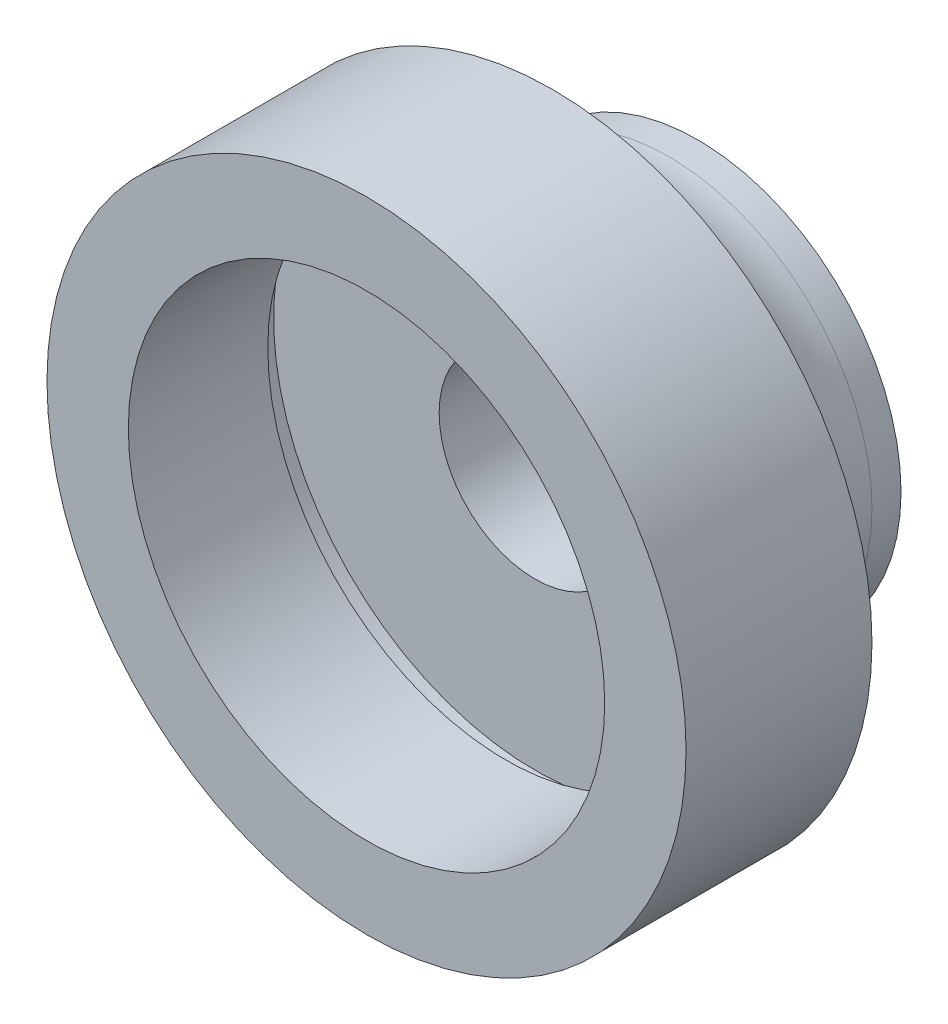
ISO-10303-21;
HEADER;
FILE_DESCRIPTION(('STEP AP214'),'2;1');
FILE_NAME('part.step','',(''),(''),'','','');
FILE_SCHEMA(('AUTOMOTIVE_DESIGN { 1 0 10303 214 1 1 1 1 }'));
ENDSEC;
DATA;
#1=APPLICATION_CONTEXT('core data for automotive mechanical design processes');
#2=APPLICATION_PROTOCOL_DEFINITION('international standard','automotive_design',2000,#1);
#3=PRODUCT_CONTEXT('',#1,'mechanical');
#4=PRODUCT('Part','Part','',(#3));
#5=PRODUCT_RELATED_PRODUCT_CATEGORY('part','',(#4));
#6=PRODUCT_DEFINITION_FORMATION('','',#4);
#7=PRODUCT_DEFINITION_CONTEXT('part definition',#1,'design');
#8=PRODUCT_DEFINITION('design','',#6,#7);
#9=PRODUCT_DEFINITION_SHAPE('','',#8);
#10=(LENGTH_UNIT() NAMED_UNIT(*) SI_UNIT(.MILLI.,.METRE.));
#11=(NAMED_UNIT(*) PLANE_ANGLE_UNIT() SI_UNIT($,.RADIAN.));
#12=(NAMED_UNIT(*) SI_UNIT($,.STERADIAN.) SOLID_ANGLE_UNIT());
#13=UNCERTAINTY_MEASURE_WITH_UNIT(LENGTH_MEASURE(1.E-05),#10,'distance_accuracy_value','');
#14=(GEOMETRIC_REPRESENTATION_CONTEXT(3) GLOBAL_UNCERTAINTY_ASSIGNED_CONTEXT((#13)) GLOBAL_UNIT_ASSIGNED_CONTEXT((#10,
#11,#12)) REPRESENTATION_CONTEXT('',''));
#15=CARTESIAN_POINT('',(0.,0.,0.));
#16=DIRECTION('',(0.,0.,1.));
#17=DIRECTION('',(1.,0.,0.));
#18=AXIS2_PLACEMENT_3D('',#15,#16,#17);
#19=CARTESIAN_POINT('',(0.,0.,-1.5));
#20=DIRECTION('',(0.,0.,1.));
#21=DIRECTION('',(1.,0.,0.));
#22=AXIS2_PLACEMENT_3D('',#19,#20,#21);
#23=CYLINDRICAL_SURFACE('',#22,3.5);
#24=CARTESIAN_POINT('',(0.,0.,-1.));
#25=DIRECTION('',(0.,0.,1.));
#26=DIRECTION('',(1.,0.,0.));
#27=AXIS2_PLACEMENT_3D('',#24,#25,#26);
#28=CIRCLE('',#27,3.5);
#29=CARTESIAN_POINT('',(3.5,0.,-1.));
#30=VERTEX_POINT('',#29);
#31=EDGE_CURVE('E10',#30,#30,#28,.F.);
#32=ORIENTED_EDGE('',*,*,#31,.T.);
#33=EDGE_LOOP('',(#32));
#34=FACE_BOUND('',#33,.T.);
#35=CARTESIAN_POINT('',(0.,0.,-1.5));
#36=DIRECTION('',(0.,0.,1.));
#37=DIRECTION('',(1.,0.,0.));
#38=AXIS2_PLACEMENT_3D('',#35,#36,#37);
#39=CIRCLE('',#38,3.5);
#40=CARTESIAN_POINT('',(3.5,0.,-1.5));
#41=VERTEX_POINT('',#40);
#42=EDGE_CURVE('E40',#41,#41,#39,.T.);
#43=ORIENTED_EDGE('',*,*,#42,.T.);
#44=EDGE_LOOP('',(#43));
#45=FACE_BOUND('',#44,.T.);
#46=ADVANCED_FACE('F32',(#34,#45),#23,.T.);
#47=CARTESIAN_POINT('',(0.,0.,-1.5));
#48=DIRECTION('',(0.,0.,1.));
#49=DIRECTION('',(1.,0.,0.));
#50=AXIS2_PLACEMENT_3D('',#47,#48,#49);
#51=PLANE('',#50);
#52=CARTESIAN_POINT('',(0.,0.,-1.5));
#53=DIRECTION('',(0.,0.,-1.));
#54=DIRECTION('',(-1.,0.,0.));
#55=AXIS2_PLACEMENT_3D('',#52,#53,#54);
#56=CIRCLE('',#55,1.65);
#57=CARTESIAN_POINT('',(-1.65,0.,-1.5));
#58=VERTEX_POINT('',#57);
#59=EDGE_CURVE('E50',#58,#58,#56,.T.);
#60=ORIENTED_EDGE('',*,*,#59,.F.);
#61=EDGE_LOOP('',(#60));
#62=FACE_BOUND('',#61,.T.);
#63=ORIENTED_EDGE('',*,*,#42,.F.);
#64=EDGE_LOOP('',(#63));
#65=FACE_BOUND('',#64,.T.);
#66=ADVANCED_FACE('F87',(#62,#65),#51,.F.);
#67=CARTESIAN_POINT('',(0.,0.,4.2));
#68=DIRECTION('',(0.,0.,-1.));
#69=DIRECTION('',(-1.,0.,0.));
#70=AXIS2_PLACEMENT_3D('',#67,#68,#69);
#71=CYLINDRICAL_SURFACE('',#70,5.5);
#72=CARTESIAN_POINT('',(0.,0.,4.2));
#73=DIRECTION('',(0.,0.,1.));
#74=DIRECTION('',(1.,0.,0.));
#75=AXIS2_PLACEMENT_3D('',#72,#73,#74);
#76=CIRCLE('',#75,5.5);
#77=CARTESIAN_POINT('',(5.5,0.,4.2));
#78=VERTEX_POINT('',#77);
#79=EDGE_CURVE('E44',#78,#78,#76,.T.);
#80=ORIENTED_EDGE('',*,*,#79,.F.);
#81=EDGE_LOOP('',(#80));
#82=FACE_BOUND('',#81,.T.);
#83=CARTESIAN_POINT('',(0.,0.,1.));
#84=DIRECTION('',(0.,0.,1.));
#85=DIRECTION('',(1.,0.,0.));
#86=AXIS2_PLACEMENT_3D('',#83,#84,#85);
#87=CIRCLE('',#86,5.5);
#88=CARTESIAN_POINT('',(5.5,0.,1.));
#89=VERTEX_POINT('',#88);
#90=EDGE_CURVE('E52',#89,#89,#87,.T.);
#91=ORIENTED_EDGE('',*,*,#90,.T.);
#92=EDGE_LOOP('',(#91));
#93=FACE_BOUND('',#92,.T.);
#94=ADVANCED_FACE('F91',(#82,#93),#71,.T.);
#95=CARTESIAN_POINT('',(0.,0.,4.2));
#96=DIRECTION('',(0.,0.,1.));
#97=DIRECTION('',(1.,0.,0.));
#98=AXIS2_PLACEMENT_3D('',#95,#96,#97);
#99=PLANE('',#98);
#100=CARTESIAN_POINT('',(0.,0.,4.2));
#101=DIRECTION('',(0.,0.,1.));
#102=DIRECTION('',(1.,0.,0.));
#103=AXIS2_PLACEMENT_3D('',#100,#101,#102);
#104=CIRCLE('',#103,4.1);
#105=CARTESIAN_POINT('',(4.1,0.,4.2));
#106=VERTEX_POINT('',#105);
#107=EDGE_CURVE('E49',#106,#106,#104,.T.);
#108=ORIENTED_EDGE('',*,*,#107,.F.);
#109=EDGE_LOOP('',(#108));
#110=FACE_BOUND('',#109,.T.);
#111=ORIENTED_EDGE('',*,*,#79,.T.);
#112=EDGE_LOOP('',(#111));
#113=FACE_BOUND('',#112,.T.);
#114=ADVANCED_FACE('F98',(#110,#113),#99,.T.);
#115=CARTESIAN_POINT('',(0.,0.,1.3));
#116=DIRECTION('',(0.,0.,1.));
#117=DIRECTION('',(1.,0.,0.));
#118=AXIS2_PLACEMENT_3D('',#115,#116,#117);
#119=CYLINDRICAL_SURFACE('',#118,4.1);
#120=CARTESIAN_POINT('',(0.,0.,1.8));
#121=DIRECTION('',(0.,0.,1.));
#122=DIRECTION('',(1.,0.,0.));
#123=AXIS2_PLACEMENT_3D('',#120,#121,#122);
#124=CIRCLE('',#123,4.1);
#125=CARTESIAN_POINT('',(4.1,0.,1.8));
#126=VERTEX_POINT('',#125);
#127=EDGE_CURVE('E36',#126,#126,#124,.F.);
#128=ORIENTED_EDGE('',*,*,#127,.T.);
#129=EDGE_LOOP('',(#128));
#130=FACE_BOUND('',#129,.T.);
#131=ORIENTED_EDGE('',*,*,#107,.T.);
#132=EDGE_LOOP('',(#131));
#133=FACE_BOUND('',#132,.T.);
#134=ADVANCED_FACE('F71',(#130,#133),#119,.F.);
#135=CARTESIAN_POINT('',(0.,0.,1.3));
#136=DIRECTION('',(0.,0.,1.));
#137=DIRECTION('',(1.,0.,0.));
#138=AXIS2_PLACEMENT_3D('',#135,#136,#137);
#139=PLANE('',#138);
#140=CARTESIAN_POINT('',(0.,0.,1.3));
#141=DIRECTION('',(0.,0.,1.));
#142=DIRECTION('',(1.,0.,0.));
#143=AXIS2_PLACEMENT_3D('',#140,#141,#142);
#144=CIRCLE('',#143,1.65);
#145=CARTESIAN_POINT('',(1.65,0.,1.3));
#146=VERTEX_POINT('',#145);
#147=EDGE_CURVE('E47',#146,#146,#144,.T.);
#148=ORIENTED_EDGE('',*,*,#147,.F.);
#149=EDGE_LOOP('',(#148));
#150=FACE_BOUND('',#149,.T.);
#151=CARTESIAN_POINT('',(0.,0.,1.3));
#152=DIRECTION('',(0.,0.,1.));
#153=DIRECTION('',(1.,0.,0.));
#154=AXIS2_PLACEMENT_3D('',#151,#152,#153);
#155=CIRCLE('',#154,4.5);
#156=CARTESIAN_POINT('',(4.5,0.,1.3));
#157=VERTEX_POINT('',#156);
#158=EDGE_CURVE('E61',#157,#157,#155,.T.);
#159=ORIENTED_EDGE('',*,*,#158,.T.);
#160=EDGE_LOOP('',(#159));
#161=FACE_BOUND('',#160,.T.);
#162=ADVANCED_FACE('F105',(#150,#161),#139,.T.);
#163=CARTESIAN_POINT('',(0.,0.,8.5));
#164=DIRECTION('',(0.,0.,-1.));
#165=DIRECTION('',(-1.,0.,0.));
#166=AXIS2_PLACEMENT_3D('',#163,#164,#165);
#167=CYLINDRICAL_SURFACE('',#166,1.65);
#168=ORIENTED_EDGE('',*,*,#147,.T.);
#169=EDGE_LOOP('',(#168));
#170=FACE_BOUND('',#169,.T.);
#171=ORIENTED_EDGE('',*,*,#59,.T.);
#172=EDGE_LOOP('',(#171));
#173=FACE_BOUND('',#172,.T.);
#174=ADVANCED_FACE('F84',(#170,#173),#167,.F.);
#175=CARTESIAN_POINT('',(0.,0.,-1.));
#176=DIRECTION('',(0.,0.,1.));
#177=DIRECTION('',(1.,0.,0.));
#178=AXIS2_PLACEMENT_3D('',#175,#176,#177);
#179=TOROIDAL_SURFACE('',#178,5.5,2.);
#180=ORIENTED_EDGE('',*,*,#31,.F.);
#181=EDGE_LOOP('',(#180));
#182=FACE_BOUND('',#181,.T.);
#183=ORIENTED_EDGE('',*,*,#90,.F.);
#184=EDGE_LOOP('',(#183));
#185=FACE_BOUND('',#184,.T.);
#186=ADVANCED_FACE('F34',(#182,#185),#179,.F.);
#187=CARTESIAN_POINT('',(0.,0.,1.8));
#188=DIRECTION('',(0.,0.,1.));
#189=DIRECTION('',(1.,0.,0.));
#190=AXIS2_PLACEMENT_3D('',#187,#188,#189);
#191=PLANE('',#190);
#192=CARTESIAN_POINT('',(0.,0.,1.8));
#193=DIRECTION('',(0.,0.,1.));
#194=DIRECTION('',(1.,0.,0.));
#195=AXIS2_PLACEMENT_3D('',#192,#193,#194);
#196=CIRCLE('',#195,4.5);
#197=CARTESIAN_POINT('',(4.5,0.,1.8));
#198=VERTEX_POINT('',#197);
#199=EDGE_CURVE('E64',#198,#198,#196,.T.);
#200=ORIENTED_EDGE('',*,*,#199,.F.);
#201=EDGE_LOOP('',(#200));
#202=FACE_BOUND('',#201,.T.);
#203=ORIENTED_EDGE('',*,*,#127,.F.);
#204=EDGE_LOOP('',(#203));
#205=FACE_BOUND('',#204,.T.);
#206=ADVANCED_FACE('F74',(#202,#205),#191,.F.);
#207=CARTESIAN_POINT('',(0.,0.,1.8));
#208=DIRECTION('',(0.,0.,-1.));
#209=DIRECTION('',(-1.,0.,0.));
#210=AXIS2_PLACEMENT_3D('',#207,#208,#209);
#211=CYLINDRICAL_SURFACE('',#210,4.5);
#212=ORIENTED_EDGE('',*,*,#199,.T.);
#213=EDGE_LOOP('',(#212));
#214=FACE_BOUND('',#213,.T.);
#215=ORIENTED_EDGE('',*,*,#158,.F.);
#216=EDGE_LOOP('',(#215));
#217=FACE_BOUND('',#216,.T.);
#218=ADVANCED_FACE('F76',(#214,#217),#211,.F.);
#219=CLOSED_SHELL('',(#46,#66,#94,#114,#134,#162,#174,#186,#206,#218));
#220=MANIFOLD_SOLID_BREP('B2',#219);
#221=ADVANCED_BREP_SHAPE_REPRESENTATION('',(#18,#220),#14);
#222=SHAPE_DEFINITION_REPRESENTATION(#9,#221);
ENDSEC;
END-ISO-10303-21;
